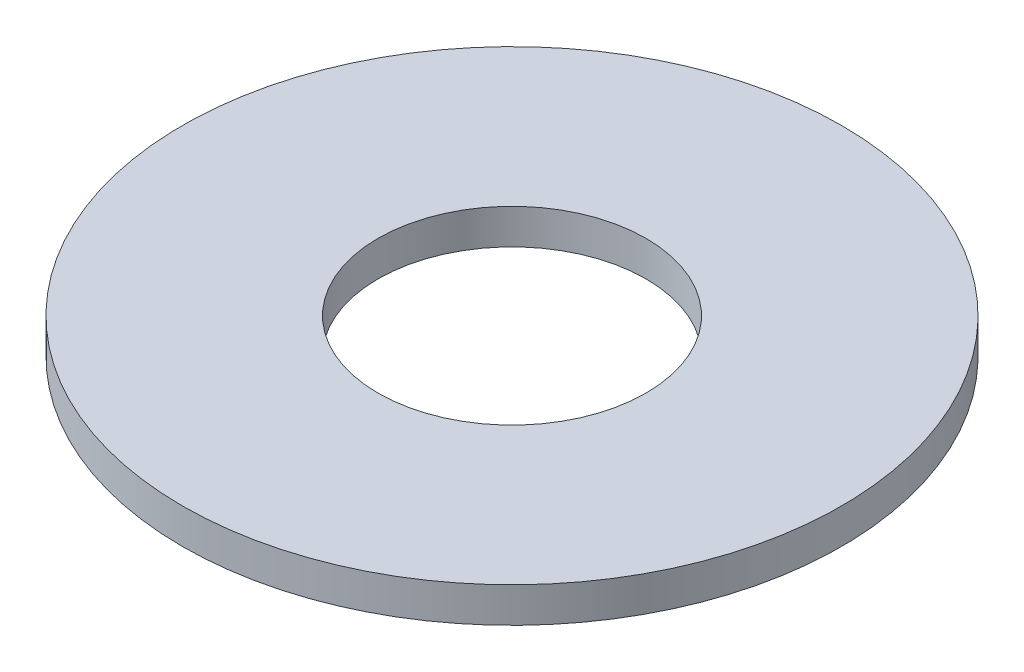
ISO-10303-21;
HEADER;
FILE_DESCRIPTION(('STEP AP214'),'2;1');
FILE_NAME('part.step','',(''),(''),'','','');
FILE_SCHEMA(('AUTOMOTIVE_DESIGN { 1 0 10303 214 1 1 1 1 }'));
ENDSEC;
DATA;
#1=APPLICATION_CONTEXT('core data for automotive mechanical design processes');
#2=APPLICATION_PROTOCOL_DEFINITION('international standard','automotive_design',2000,#1);
#3=PRODUCT_CONTEXT('',#1,'mechanical');
#4=PRODUCT('Part','Part','',(#3));
#5=PRODUCT_RELATED_PRODUCT_CATEGORY('part','',(#4));
#6=PRODUCT_DEFINITION_FORMATION('','',#4);
#7=PRODUCT_DEFINITION_CONTEXT('part definition',#1,'design');
#8=PRODUCT_DEFINITION('design','',#6,#7);
#9=PRODUCT_DEFINITION_SHAPE('','',#8);
#10=(LENGTH_UNIT() NAMED_UNIT(*) SI_UNIT(.MILLI.,.METRE.));
#11=(NAMED_UNIT(*) PLANE_ANGLE_UNIT() SI_UNIT($,.RADIAN.));
#12=(NAMED_UNIT(*) SI_UNIT($,.STERADIAN.) SOLID_ANGLE_UNIT());
#13=UNCERTAINTY_MEASURE_WITH_UNIT(LENGTH_MEASURE(1.E-05),#10,'distance_accuracy_value','');
#14=(GEOMETRIC_REPRESENTATION_CONTEXT(3) GLOBAL_UNCERTAINTY_ASSIGNED_CONTEXT((#13)) GLOBAL_UNIT_ASSIGNED_CONTEXT((#10,
#11,#12)) REPRESENTATION_CONTEXT('',''));
#15=CARTESIAN_POINT('',(0.,0.,0.));
#16=DIRECTION('',(0.,0.,1.));
#17=DIRECTION('',(1.,0.,0.));
#18=AXIS2_PLACEMENT_3D('',#15,#16,#17);
#19=CARTESIAN_POINT('',(0.,2.,0.));
#20=DIRECTION('',(0.,1.,0.));
#21=DIRECTION('',(0.,0.,1.));
#22=AXIS2_PLACEMENT_3D('',#19,#20,#21);
#23=PLANE('',#22);
#24=CARTESIAN_POINT('',(0.,2.,0.));
#25=DIRECTION('',(0.,1.,0.));
#26=DIRECTION('',(0.,0.,1.));
#27=AXIS2_PLACEMENT_3D('',#24,#25,#26);
#28=CIRCLE('',#27,18.75);
#29=CARTESIAN_POINT('',(0.,2.,18.75));
#30=VERTEX_POINT('',#29);
#31=EDGE_CURVE('E10',#30,#30,#28,.T.);
#32=ORIENTED_EDGE('',*,*,#31,.T.);
#33=EDGE_LOOP('',(#32));
#34=FACE_BOUND('',#33,.T.);
#35=CARTESIAN_POINT('',(0.,2.,0.));
#36=DIRECTION('',(0.,1.,0.));
#37=DIRECTION('',(0.,0.,1.));
#38=AXIS2_PLACEMENT_3D('',#35,#36,#37);
#39=CIRCLE('',#38,7.625);
#40=CARTESIAN_POINT('',(0.,2.,7.625));
#41=VERTEX_POINT('',#40);
#42=EDGE_CURVE('E56',#41,#41,#39,.T.);
#43=ORIENTED_EDGE('',*,*,#42,.F.);
#44=EDGE_LOOP('',(#43));
#45=FACE_BOUND('',#44,.T.);
#46=ADVANCED_FACE('F43',(#34,#45),#23,.T.);
#47=CARTESIAN_POINT('',(0.,0.,0.));
#48=DIRECTION('',(0.,1.,0.));
#49=DIRECTION('',(0.,0.,1.));
#50=AXIS2_PLACEMENT_3D('',#47,#48,#49);
#51=PLANE('',#50);
#52=CARTESIAN_POINT('',(0.,0.,0.));
#53=DIRECTION('',(0.,1.,0.));
#54=DIRECTION('',(0.,0.,1.));
#55=AXIS2_PLACEMENT_3D('',#52,#53,#54);
#56=CIRCLE('',#55,18.75);
#57=CARTESIAN_POINT('',(0.,0.,18.75));
#58=VERTEX_POINT('',#57);
#59=EDGE_CURVE('E47',#58,#58,#56,.T.);
#60=ORIENTED_EDGE('',*,*,#59,.F.);
#61=EDGE_LOOP('',(#60));
#62=FACE_BOUND('',#61,.T.);
#63=CARTESIAN_POINT('',(0.,0.,0.));
#64=DIRECTION('',(0.,1.,0.));
#65=DIRECTION('',(0.,0.,1.));
#66=AXIS2_PLACEMENT_3D('',#63,#64,#65);
#67=CIRCLE('',#66,7.625);
#68=CARTESIAN_POINT('',(0.,0.,7.625));
#69=VERTEX_POINT('',#68);
#70=EDGE_CURVE('E58',#69,#69,#67,.T.);
#71=ORIENTED_EDGE('',*,*,#70,.T.);
#72=EDGE_LOOP('',(#71));
#73=FACE_BOUND('',#72,.T.);
#74=ADVANCED_FACE('F70',(#62,#73),#51,.F.);
#75=CARTESIAN_POINT('',(0.,2.,0.));
#76=DIRECTION('',(0.,-1.,0.));
#77=DIRECTION('',(0.,0.,-1.));
#78=AXIS2_PLACEMENT_3D('',#75,#76,#77);
#79=CYLINDRICAL_SURFACE('',#78,18.75);
#80=ORIENTED_EDGE('',*,*,#31,.F.);
#81=EDGE_LOOP('',(#80));
#82=FACE_BOUND('',#81,.T.);
#83=ORIENTED_EDGE('',*,*,#59,.T.);
#84=EDGE_LOOP('',(#83));
#85=FACE_BOUND('',#84,.T.);
#86=ADVANCED_FACE('F45',(#82,#85),#79,.T.);
#87=CARTESIAN_POINT('',(0.,2.,0.));
#88=DIRECTION('',(0.,-1.,0.));
#89=DIRECTION('',(0.,0.,-1.));
#90=AXIS2_PLACEMENT_3D('',#87,#88,#89);
#91=CYLINDRICAL_SURFACE('',#90,7.625);
#92=ORIENTED_EDGE('',*,*,#42,.T.);
#93=EDGE_LOOP('',(#92));
#94=FACE_BOUND('',#93,.T.);
#95=ORIENTED_EDGE('',*,*,#70,.F.);
#96=EDGE_LOOP('',(#95));
#97=FACE_BOUND('',#96,.T.);
#98=ADVANCED_FACE('F66',(#94,#97),#91,.F.);
#99=CLOSED_SHELL('',(#46,#74,#86,#98));
#100=MANIFOLD_SOLID_BREP('B2',#99);
#101=ADVANCED_BREP_SHAPE_REPRESENTATION('',(#18,#100),#14);
#102=SHAPE_DEFINITION_REPRESENTATION(#9,#101);
ENDSEC;
END-ISO-10303-21;
